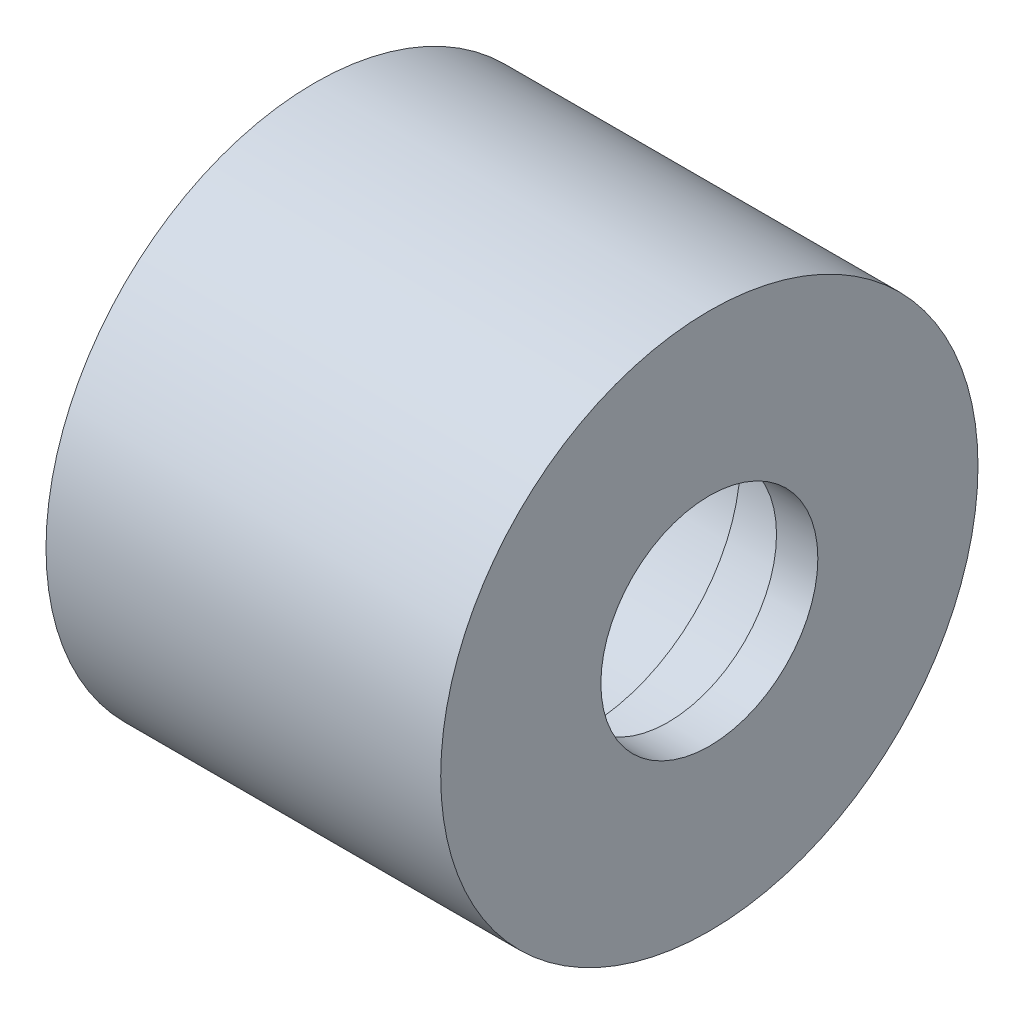
ISO-10303-21;
HEADER;
FILE_DESCRIPTION(('STEP AP214'),'2;1');
FILE_NAME('part.step','',(''),(''),'','','');
FILE_SCHEMA(('AUTOMOTIVE_DESIGN { 1 0 10303 214 1 1 1 1 }'));
ENDSEC;
DATA;
#1=APPLICATION_CONTEXT('core data for automotive mechanical design processes');
#2=APPLICATION_PROTOCOL_DEFINITION('international standard','automotive_design',2000,#1);
#3=PRODUCT_CONTEXT('',#1,'mechanical');
#4=PRODUCT('Part','Part','',(#3));
#5=PRODUCT_RELATED_PRODUCT_CATEGORY('part','',(#4));
#6=PRODUCT_DEFINITION_FORMATION('','',#4);
#7=PRODUCT_DEFINITION_CONTEXT('part definition',#1,'design');
#8=PRODUCT_DEFINITION('design','',#6,#7);
#9=PRODUCT_DEFINITION_SHAPE('','',#8);
#10=(LENGTH_UNIT() NAMED_UNIT(*) SI_UNIT(.MILLI.,.METRE.));
#11=(NAMED_UNIT(*) PLANE_ANGLE_UNIT() SI_UNIT($,.RADIAN.));
#12=(NAMED_UNIT(*) SI_UNIT($,.STERADIAN.) SOLID_ANGLE_UNIT());
#13=UNCERTAINTY_MEASURE_WITH_UNIT(LENGTH_MEASURE(1.E-05),#10,'distance_accuracy_value','');
#14=(GEOMETRIC_REPRESENTATION_CONTEXT(3) GLOBAL_UNCERTAINTY_ASSIGNED_CONTEXT((#13)) GLOBAL_UNIT_ASSIGNED_CONTEXT((#10,
#11,#12)) REPRESENTATION_CONTEXT('',''));
#15=CARTESIAN_POINT('',(0.,0.,0.));
#16=DIRECTION('',(0.,0.,1.));
#17=DIRECTION('',(1.,0.,0.));
#18=AXIS2_PLACEMENT_3D('',#15,#16,#17);
#19=CARTESIAN_POINT('',(-4.43776607242441,0.,0.));
#20=DIRECTION('',(-1.,0.,0.));
#21=DIRECTION('',(0.,0.,1.));
#22=AXIS2_PLACEMENT_3D('',#19,#20,#21);
#23=CYLINDRICAL_SURFACE('',#22,21.);
#24=CARTESIAN_POINT('',(0.,0.,0.));
#25=DIRECTION('',(-1.,0.,0.));
#26=DIRECTION('',(0.,0.,1.));
#27=AXIS2_PLACEMENT_3D('',#24,#25,#26);
#28=CIRCLE('',#27,21.);
#29=CARTESIAN_POINT('',(0.,0.,21.));
#30=VERTEX_POINT('',#29);
#31=EDGE_CURVE('E118',#30,#30,#28,.T.);
#32=ORIENTED_EDGE('',*,*,#31,.T.);
#33=EDGE_LOOP('',(#32));
#34=FACE_BOUND('',#33,.T.);
#35=CARTESIAN_POINT('',(15.5,0.,0.));
#36=DIRECTION('',(-1.,0.,0.));
#37=DIRECTION('',(0.,0.,1.));
#38=AXIS2_PLACEMENT_3D('',#35,#36,#37);
#39=CIRCLE('',#38,21.);
#40=CARTESIAN_POINT('',(15.5,0.,21.));
#41=VERTEX_POINT('',#40);
#42=EDGE_CURVE('E11',#41,#41,#39,.T.);
#43=ORIENTED_EDGE('',*,*,#42,.F.);
#44=EDGE_LOOP('',(#43));
#45=FACE_BOUND('',#44,.T.);
#46=ADVANCED_FACE('F47',(#34,#45),#23,.F.);
#47=CARTESIAN_POINT('',(15.5,0.,0.));
#48=DIRECTION('',(-1.,0.,0.));
#49=DIRECTION('',(0.,0.,1.));
#50=AXIS2_PLACEMENT_3D('',#47,#48,#49);
#51=PLANE('',#50);
#52=ORIENTED_EDGE('',*,*,#42,.T.);
#53=EDGE_LOOP('',(#52));
#54=FACE_BOUND('',#53,.T.);
#55=CARTESIAN_POINT('',(15.5,0.,0.));
#56=DIRECTION('',(-1.,0.,0.));
#57=DIRECTION('',(0.,0.,1.));
#58=AXIS2_PLACEMENT_3D('',#55,#56,#57);
#59=CIRCLE('',#58,20.);
#60=CARTESIAN_POINT('',(15.5,0.,20.));
#61=VERTEX_POINT('',#60);
#62=EDGE_CURVE('E54',#61,#61,#59,.T.);
#63=ORIENTED_EDGE('',*,*,#62,.F.);
#64=EDGE_LOOP('',(#63));
#65=FACE_BOUND('',#64,.T.);
#66=ADVANCED_FACE('F153',(#54,#65),#51,.T.);
#67=CARTESIAN_POINT('',(-4.43776607242441,0.,0.));
#68=DIRECTION('',(-1.,0.,0.));
#69=DIRECTION('',(0.,0.,1.));
#70=AXIS2_PLACEMENT_3D('',#67,#68,#69);
#71=CYLINDRICAL_SURFACE('',#70,20.);
#72=ORIENTED_EDGE('',*,*,#62,.T.);
#73=EDGE_LOOP('',(#72));
#74=FACE_BOUND('',#73,.T.);
#75=CARTESIAN_POINT('',(19.2,0.,0.));
#76=DIRECTION('',(-1.,0.,0.));
#77=DIRECTION('',(0.,0.,1.));
#78=AXIS2_PLACEMENT_3D('',#75,#76,#77);
#79=CIRCLE('',#78,20.);
#80=CARTESIAN_POINT('',(19.2,0.,20.));
#81=VERTEX_POINT('',#80);
#82=EDGE_CURVE('E145',#81,#81,#79,.T.);
#83=ORIENTED_EDGE('',*,*,#82,.F.);
#84=EDGE_LOOP('',(#83));
#85=FACE_BOUND('',#84,.T.);
#86=ADVANCED_FACE('F150',(#74,#85),#71,.F.);
#87=CARTESIAN_POINT('',(19.2,0.,0.));
#88=DIRECTION('',(-1.,0.,0.));
#89=DIRECTION('',(0.,0.,1.));
#90=AXIS2_PLACEMENT_3D('',#87,#88,#89);
#91=PLANE('',#90);
#92=ORIENTED_EDGE('',*,*,#82,.T.);
#93=EDGE_LOOP('',(#92));
#94=FACE_BOUND('',#93,.T.);
#95=CARTESIAN_POINT('',(19.2,0.,0.));
#96=DIRECTION('',(-1.,0.,0.));
#97=DIRECTION('',(0.,0.,1.));
#98=AXIS2_PLACEMENT_3D('',#95,#96,#97);
#99=CIRCLE('',#98,16.);
#100=CARTESIAN_POINT('',(19.2,0.,16.));
#101=VERTEX_POINT('',#100);
#102=EDGE_CURVE('E142',#101,#101,#99,.T.);
#103=ORIENTED_EDGE('',*,*,#102,.F.);
#104=EDGE_LOOP('',(#103));
#105=FACE_BOUND('',#104,.T.);
#106=ADVANCED_FACE('F160',(#94,#105),#91,.T.);
#107=CARTESIAN_POINT('',(-4.43776607242441,0.,0.));
#108=DIRECTION('',(-1.,0.,0.));
#109=DIRECTION('',(0.,0.,1.));
#110=AXIS2_PLACEMENT_3D('',#107,#108,#109);
#111=CYLINDRICAL_SURFACE('',#110,16.);
#112=ORIENTED_EDGE('',*,*,#102,.T.);
#113=EDGE_LOOP('',(#112));
#114=FACE_BOUND('',#113,.T.);
#115=CARTESIAN_POINT('',(26.2,0.,0.));
#116=DIRECTION('',(-1.,0.,0.));
#117=DIRECTION('',(0.,0.,1.));
#118=AXIS2_PLACEMENT_3D('',#115,#116,#117);
#119=CIRCLE('',#118,16.);
#120=CARTESIAN_POINT('',(26.2,0.,16.));
#121=VERTEX_POINT('',#120);
#122=EDGE_CURVE('E139',#121,#121,#119,.T.);
#123=ORIENTED_EDGE('',*,*,#122,.F.);
#124=EDGE_LOOP('',(#123));
#125=FACE_BOUND('',#124,.T.);
#126=ADVANCED_FACE('F166',(#114,#125),#111,.F.);
#127=CARTESIAN_POINT('',(26.2,0.,0.));
#128=DIRECTION('',(-1.,0.,0.));
#129=DIRECTION('',(0.,0.,1.));
#130=AXIS2_PLACEMENT_3D('',#127,#128,#129);
#131=PLANE('',#130);
#132=ORIENTED_EDGE('',*,*,#122,.T.);
#133=EDGE_LOOP('',(#132));
#134=FACE_BOUND('',#133,.T.);
#135=CARTESIAN_POINT('',(26.2,0.,0.));
#136=DIRECTION('',(-1.,0.,0.));
#137=DIRECTION('',(0.,0.,1.));
#138=AXIS2_PLACEMENT_3D('',#135,#136,#137);
#139=CIRCLE('',#138,15.);
#140=CARTESIAN_POINT('',(26.2,0.,15.));
#141=VERTEX_POINT('',#140);
#142=EDGE_CURVE('E136',#141,#141,#139,.T.);
#143=ORIENTED_EDGE('',*,*,#142,.F.);
#144=EDGE_LOOP('',(#143));
#145=FACE_BOUND('',#144,.T.);
#146=ADVANCED_FACE('F170',(#134,#145),#131,.T.);
#147=CARTESIAN_POINT('',(-4.43776607242441,0.,0.));
#148=DIRECTION('',(-1.,0.,0.));
#149=DIRECTION('',(0.,0.,1.));
#150=AXIS2_PLACEMENT_3D('',#147,#148,#149);
#151=CYLINDRICAL_SURFACE('',#150,15.);
#152=ORIENTED_EDGE('',*,*,#142,.T.);
#153=EDGE_LOOP('',(#152));
#154=FACE_BOUND('',#153,.T.);
#155=CARTESIAN_POINT('',(34.2,0.,0.));
#156=DIRECTION('',(-1.,0.,0.));
#157=DIRECTION('',(0.,0.,1.));
#158=AXIS2_PLACEMENT_3D('',#155,#156,#157);
#159=CIRCLE('',#158,15.);
#160=CARTESIAN_POINT('',(34.2,0.,15.));
#161=VERTEX_POINT('',#160);
#162=EDGE_CURVE('E133',#161,#161,#159,.T.);
#163=ORIENTED_EDGE('',*,*,#162,.F.);
#164=EDGE_LOOP('',(#163));
#165=FACE_BOUND('',#164,.T.);
#166=ADVANCED_FACE('F174',(#154,#165),#151,.F.);
#167=CARTESIAN_POINT('',(34.2,0.,0.));
#168=DIRECTION('',(-1.,0.,0.));
#169=DIRECTION('',(0.,0.,1.));
#170=AXIS2_PLACEMENT_3D('',#167,#168,#169);
#171=PLANE('',#170);
#172=ORIENTED_EDGE('',*,*,#162,.T.);
#173=EDGE_LOOP('',(#172));
#174=FACE_BOUND('',#173,.T.);
#175=CARTESIAN_POINT('',(34.2,0.,0.));
#176=DIRECTION('',(-1.,0.,0.));
#177=DIRECTION('',(0.,0.,1.));
#178=AXIS2_PLACEMENT_3D('',#175,#176,#177);
#179=CIRCLE('',#178,10.5);
#180=CARTESIAN_POINT('',(34.2,0.,10.5));
#181=VERTEX_POINT('',#180);
#182=EDGE_CURVE('E130',#181,#181,#179,.T.);
#183=ORIENTED_EDGE('',*,*,#182,.F.);
#184=EDGE_LOOP('',(#183));
#185=FACE_BOUND('',#184,.T.);
#186=ADVANCED_FACE('F178',(#174,#185),#171,.T.);
#187=CARTESIAN_POINT('',(-4.43776607242441,0.,0.));
#188=DIRECTION('',(-1.,0.,0.));
#189=DIRECTION('',(0.,0.,1.));
#190=AXIS2_PLACEMENT_3D('',#187,#188,#189);
#191=CYLINDRICAL_SURFACE('',#190,10.5);
#192=ORIENTED_EDGE('',*,*,#182,.T.);
#193=EDGE_LOOP('',(#192));
#194=FACE_BOUND('',#193,.T.);
#195=CARTESIAN_POINT('',(38.2,0.,0.));
#196=DIRECTION('',(-1.,0.,0.));
#197=DIRECTION('',(0.,0.,1.));
#198=AXIS2_PLACEMENT_3D('',#195,#196,#197);
#199=CIRCLE('',#198,10.5);
#200=CARTESIAN_POINT('',(38.2,0.,10.5));
#201=VERTEX_POINT('',#200);
#202=EDGE_CURVE('E127',#201,#201,#199,.T.);
#203=ORIENTED_EDGE('',*,*,#202,.F.);
#204=EDGE_LOOP('',(#203));
#205=FACE_BOUND('',#204,.T.);
#206=ADVANCED_FACE('F182',(#194,#205),#191,.F.);
#207=CARTESIAN_POINT('',(38.2,0.,0.));
#208=DIRECTION('',(1.,0.,0.));
#209=DIRECTION('',(0.,0.,-1.));
#210=AXIS2_PLACEMENT_3D('',#207,#208,#209);
#211=PLANE('',#210);
#212=ORIENTED_EDGE('',*,*,#202,.T.);
#213=EDGE_LOOP('',(#212));
#214=FACE_BOUND('',#213,.T.);
#215=CARTESIAN_POINT('',(38.2,0.,0.));
#216=DIRECTION('',(-1.,0.,0.));
#217=DIRECTION('',(0.,0.,1.));
#218=AXIS2_PLACEMENT_3D('',#215,#216,#217);
#219=CIRCLE('',#218,26.);
#220=CARTESIAN_POINT('',(38.2,0.,26.));
#221=VERTEX_POINT('',#220);
#222=EDGE_CURVE('E124',#221,#221,#219,.T.);
#223=ORIENTED_EDGE('',*,*,#222,.F.);
#224=EDGE_LOOP('',(#223));
#225=FACE_BOUND('',#224,.T.);
#226=ADVANCED_FACE('F186',(#214,#225),#211,.T.);
#227=CARTESIAN_POINT('',(-4.43776607242441,0.,0.));
#228=DIRECTION('',(-1.,0.,0.));
#229=DIRECTION('',(0.,0.,1.));
#230=AXIS2_PLACEMENT_3D('',#227,#228,#229);
#231=CYLINDRICAL_SURFACE('',#230,26.);
#232=ORIENTED_EDGE('',*,*,#222,.T.);
#233=EDGE_LOOP('',(#232));
#234=FACE_BOUND('',#233,.T.);
#235=CARTESIAN_POINT('',(0.,0.,0.));
#236=DIRECTION('',(-1.,0.,0.));
#237=DIRECTION('',(0.,0.,1.));
#238=AXIS2_PLACEMENT_3D('',#235,#236,#237);
#239=CIRCLE('',#238,26.);
#240=CARTESIAN_POINT('',(0.,0.,26.));
#241=VERTEX_POINT('',#240);
#242=EDGE_CURVE('E121',#241,#241,#239,.T.);
#243=ORIENTED_EDGE('',*,*,#242,.F.);
#244=EDGE_LOOP('',(#243));
#245=FACE_BOUND('',#244,.T.);
#246=ADVANCED_FACE('F190',(#234,#245),#231,.T.);
#247=CARTESIAN_POINT('',(0.,0.,0.));
#248=DIRECTION('',(-1.,0.,0.));
#249=DIRECTION('',(0.,0.,1.));
#250=AXIS2_PLACEMENT_3D('',#247,#248,#249);
#251=PLANE('',#250);
#252=CARTESIAN_POINT('',(0.,2.20309881449055E-13,23.5));
#253=DIRECTION('',(-1.,0.,0.));
#254=DIRECTION('',(0.,0.,1.));
#255=AXIS2_PLACEMENT_3D('',#252,#253,#254);
#256=CIRCLE('',#255,1.24999999999999);
#257=CARTESIAN_POINT('',(0.,2.20309881449055E-13,24.75));
#258=VERTEX_POINT('',#257);
#259=EDGE_CURVE('E84',#258,#258,#256,.T.);
#260=ORIENTED_EDGE('',*,*,#259,.F.);
#261=EDGE_LOOP('',(#260));
#262=FACE_BOUND('',#261,.T.);
#263=CARTESIAN_POINT('',(0.,-20.3515969889342,11.7500000000001));
#264=DIRECTION('',(-1.,0.,0.));
#265=DIRECTION('',(0.,0.,1.));
#266=AXIS2_PLACEMENT_3D('',#263,#264,#265);
#267=CIRCLE('',#266,1.24999999999999);
#268=CARTESIAN_POINT('',(0.,-20.3515969889342,13.0000000000001));
#269=VERTEX_POINT('',#268);
#270=EDGE_CURVE('E83',#269,#269,#267,.T.);
#271=ORIENTED_EDGE('',*,*,#270,.F.);
#272=EDGE_LOOP('',(#271));
#273=FACE_BOUND('',#272,.T.);
#274=CARTESIAN_POINT('',(0.,-20.3515969889343,-11.75));
#275=DIRECTION('',(-1.,0.,0.));
#276=DIRECTION('',(0.,0.,1.));
#277=AXIS2_PLACEMENT_3D('',#274,#275,#276);
#278=CIRCLE('',#277,1.24999999999999);
#279=CARTESIAN_POINT('',(0.,-20.3515969889343,-10.5000000000001));
#280=VERTEX_POINT('',#279);
#281=EDGE_CURVE('E94',#280,#280,#278,.T.);
#282=ORIENTED_EDGE('',*,*,#281,.F.);
#283=EDGE_LOOP('',(#282));
#284=FACE_BOUND('',#283,.T.);
#285=CARTESIAN_POINT('',(0.,0.,-23.5));
#286=DIRECTION('',(-1.,0.,0.));
#287=DIRECTION('',(0.,0.,1.));
#288=AXIS2_PLACEMENT_3D('',#285,#286,#287);
#289=CIRCLE('',#288,1.24999999999999);
#290=CARTESIAN_POINT('',(0.,0.,-22.25));
#291=VERTEX_POINT('',#290);
#292=EDGE_CURVE('E100',#291,#291,#289,.T.);
#293=ORIENTED_EDGE('',*,*,#292,.F.);
#294=EDGE_LOOP('',(#293));
#295=FACE_BOUND('',#294,.T.);
#296=CARTESIAN_POINT('',(0.,20.3515969889343,-11.75));
#297=DIRECTION('',(-1.,0.,0.));
#298=DIRECTION('',(0.,0.,1.));
#299=AXIS2_PLACEMENT_3D('',#296,#297,#298);
#300=CIRCLE('',#299,1.24999999999999);
#301=CARTESIAN_POINT('',(0.,20.3515969889343,-10.5));
#302=VERTEX_POINT('',#301);
#303=EDGE_CURVE('E106',#302,#302,#300,.T.);
#304=ORIENTED_EDGE('',*,*,#303,.F.);
#305=EDGE_LOOP('',(#304));
#306=FACE_BOUND('',#305,.T.);
#307=CARTESIAN_POINT('',(0.,20.3515969889343,11.75));
#308=DIRECTION('',(-1.,0.,0.));
#309=DIRECTION('',(0.,0.,1.));
#310=AXIS2_PLACEMENT_3D('',#307,#308,#309);
#311=CIRCLE('',#310,1.24999999999999);
#312=CARTESIAN_POINT('',(0.,20.3515969889343,13.));
#313=VERTEX_POINT('',#312);
#314=EDGE_CURVE('E112',#313,#313,#311,.T.);
#315=ORIENTED_EDGE('',*,*,#314,.F.);
#316=EDGE_LOOP('',(#315));
#317=FACE_BOUND('',#316,.T.);
#318=ORIENTED_EDGE('',*,*,#242,.T.);
#319=EDGE_LOOP('',(#318));
#320=FACE_BOUND('',#319,.T.);
#321=ORIENTED_EDGE('',*,*,#31,.F.);
#322=EDGE_LOOP('',(#321));
#323=FACE_BOUND('',#322,.T.);
#324=ADVANCED_FACE('F194',(#262,#273,#284,#295,#306,#317,#320,#323),#251,.T.);
#325=CARTESIAN_POINT('',(7.49999999999999,20.3515969889343,11.75));
#326=DIRECTION('',(-1.,0.,0.));
#327=DIRECTION('',(0.,0.,1.));
#328=AXIS2_PLACEMENT_3D('',#325,#326,#327);
#329=CONICAL_SURFACE('',#328,1.24999999999999,1.02974425867664);
#330=CARTESIAN_POINT('',(8.25107577378445,20.3515969889343,11.75));
#331=VERTEX_POINT('',#330);
#332=VERTEX_LOOP('',#331);
#333=FACE_BOUND('',#332,.T.);
#334=CARTESIAN_POINT('',(7.49999999999999,20.3515969889343,11.75));
#335=DIRECTION('',(-1.,0.,0.));
#336=DIRECTION('',(0.,0.,1.));
#337=AXIS2_PLACEMENT_3D('',#334,#335,#336);
#338=CIRCLE('',#337,1.24999999999999);
#339=CARTESIAN_POINT('',(7.49999999999999,20.3515969889343,13.));
#340=VERTEX_POINT('',#339);
#341=EDGE_CURVE('E115',#340,#340,#338,.T.);
#342=ORIENTED_EDGE('',*,*,#341,.T.);
#343=EDGE_LOOP('',(#342));
#344=FACE_BOUND('',#343,.T.);
#345=ADVANCED_FACE('F198',(#333,#344),#329,.F.);
#346=CARTESIAN_POINT('',(0.,20.3515969889343,11.75));
#347=DIRECTION('',(-1.,0.,0.));
#348=DIRECTION('',(0.,0.,1.));
#349=AXIS2_PLACEMENT_3D('',#346,#347,#348);
#350=CYLINDRICAL_SURFACE('',#349,1.24999999999999);
#351=ORIENTED_EDGE('',*,*,#341,.F.);
#352=EDGE_LOOP('',(#351));
#353=FACE_BOUND('',#352,.T.);
#354=ORIENTED_EDGE('',*,*,#314,.T.);
#355=EDGE_LOOP('',(#354));
#356=FACE_BOUND('',#355,.T.);
#357=ADVANCED_FACE('F202',(#353,#356),#350,.F.);
#358=CARTESIAN_POINT('',(7.49999999999999,20.3515969889343,-11.75));
#359=DIRECTION('',(-1.,0.,0.));
#360=DIRECTION('',(0.,0.,1.));
#361=AXIS2_PLACEMENT_3D('',#358,#359,#360);
#362=CONICAL_SURFACE('',#361,1.24999999999999,1.02974425867664);
#363=CARTESIAN_POINT('',(8.25107577378445,20.3515969889343,-11.75));
#364=VERTEX_POINT('',#363);
#365=VERTEX_LOOP('',#364);
#366=FACE_BOUND('',#365,.T.);
#367=CARTESIAN_POINT('',(7.49999999999999,20.3515969889343,-11.75));
#368=DIRECTION('',(-1.,0.,0.));
#369=DIRECTION('',(0.,0.,1.));
#370=AXIS2_PLACEMENT_3D('',#367,#368,#369);
#371=CIRCLE('',#370,1.24999999999999);
#372=CARTESIAN_POINT('',(7.49999999999999,20.3515969889343,-10.5));
#373=VERTEX_POINT('',#372);
#374=EDGE_CURVE('E109',#373,#373,#371,.T.);
#375=ORIENTED_EDGE('',*,*,#374,.T.);
#376=EDGE_LOOP('',(#375));
#377=FACE_BOUND('',#376,.T.);
#378=ADVANCED_FACE('F205',(#366,#377),#362,.F.);
#379=CARTESIAN_POINT('',(0.,20.3515969889343,-11.75));
#380=DIRECTION('',(-1.,0.,0.));
#381=DIRECTION('',(0.,0.,1.));
#382=AXIS2_PLACEMENT_3D('',#379,#380,#381);
#383=CYLINDRICAL_SURFACE('',#382,1.24999999999999);
#384=ORIENTED_EDGE('',*,*,#374,.F.);
#385=EDGE_LOOP('',(#384));
#386=FACE_BOUND('',#385,.T.);
#387=ORIENTED_EDGE('',*,*,#303,.T.);
#388=EDGE_LOOP('',(#387));
#389=FACE_BOUND('',#388,.T.);
#390=ADVANCED_FACE('F209',(#386,#389),#383,.F.);
#391=CARTESIAN_POINT('',(7.49999999999999,0.,-23.5));
#392=DIRECTION('',(-1.,0.,0.));
#393=DIRECTION('',(0.,0.,1.));
#394=AXIS2_PLACEMENT_3D('',#391,#392,#393);
#395=CONICAL_SURFACE('',#394,1.24999999999999,1.02974425867664);
#396=CARTESIAN_POINT('',(8.25107577378445,0.,-23.5));
#397=VERTEX_POINT('',#396);
#398=VERTEX_LOOP('',#397);
#399=FACE_BOUND('',#398,.T.);
#400=CARTESIAN_POINT('',(7.49999999999999,0.,-23.5));
#401=DIRECTION('',(-1.,0.,0.));
#402=DIRECTION('',(0.,0.,1.));
#403=AXIS2_PLACEMENT_3D('',#400,#401,#402);
#404=CIRCLE('',#403,1.24999999999999);
#405=CARTESIAN_POINT('',(7.49999999999999,0.,-22.25));
#406=VERTEX_POINT('',#405);
#407=EDGE_CURVE('E103',#406,#406,#404,.T.);
#408=ORIENTED_EDGE('',*,*,#407,.T.);
#409=EDGE_LOOP('',(#408));
#410=FACE_BOUND('',#409,.T.);
#411=ADVANCED_FACE('F212',(#399,#410),#395,.F.);
#412=CARTESIAN_POINT('',(0.,0.,-23.5));
#413=DIRECTION('',(-1.,0.,0.));
#414=DIRECTION('',(0.,0.,1.));
#415=AXIS2_PLACEMENT_3D('',#412,#413,#414);
#416=CYLINDRICAL_SURFACE('',#415,1.24999999999999);
#417=ORIENTED_EDGE('',*,*,#407,.F.);
#418=EDGE_LOOP('',(#417));
#419=FACE_BOUND('',#418,.T.);
#420=ORIENTED_EDGE('',*,*,#292,.T.);
#421=EDGE_LOOP('',(#420));
#422=FACE_BOUND('',#421,.T.);
#423=ADVANCED_FACE('F216',(#419,#422),#416,.F.);
#424=CARTESIAN_POINT('',(7.49999999999999,-20.3515969889343,-11.75));
#425=DIRECTION('',(-1.,0.,0.));
#426=DIRECTION('',(0.,0.,1.));
#427=AXIS2_PLACEMENT_3D('',#424,#425,#426);
#428=CONICAL_SURFACE('',#427,1.24999999999999,1.02974425867664);
#429=CARTESIAN_POINT('',(8.25107577378445,-20.3515969889343,-11.75));
#430=VERTEX_POINT('',#429);
#431=VERTEX_LOOP('',#430);
#432=FACE_BOUND('',#431,.T.);
#433=CARTESIAN_POINT('',(7.49999999999999,-20.3515969889343,-11.75));
#434=DIRECTION('',(-1.,0.,0.));
#435=DIRECTION('',(0.,0.,1.));
#436=AXIS2_PLACEMENT_3D('',#433,#434,#435);
#437=CIRCLE('',#436,1.24999999999999);
#438=CARTESIAN_POINT('',(7.49999999999999,-20.3515969889343,-10.5000000000001));
#439=VERTEX_POINT('',#438);
#440=EDGE_CURVE('E97',#439,#439,#437,.T.);
#441=ORIENTED_EDGE('',*,*,#440,.T.);
#442=EDGE_LOOP('',(#441));
#443=FACE_BOUND('',#442,.T.);
#444=ADVANCED_FACE('F220',(#432,#443),#428,.F.);
#445=CARTESIAN_POINT('',(0.,-20.3515969889343,-11.75));
#446=DIRECTION('',(-1.,0.,0.));
#447=DIRECTION('',(0.,0.,1.));
#448=AXIS2_PLACEMENT_3D('',#445,#446,#447);
#449=CYLINDRICAL_SURFACE('',#448,1.24999999999999);
#450=ORIENTED_EDGE('',*,*,#440,.F.);
#451=EDGE_LOOP('',(#450));
#452=FACE_BOUND('',#451,.T.);
#453=ORIENTED_EDGE('',*,*,#281,.T.);
#454=EDGE_LOOP('',(#453));
#455=FACE_BOUND('',#454,.T.);
#456=ADVANCED_FACE('F224',(#452,#455),#449,.F.);
#457=CARTESIAN_POINT('',(7.49999999999999,-20.3515969889342,11.7500000000001));
#458=DIRECTION('',(-1.,0.,0.));
#459=DIRECTION('',(0.,0.,1.));
#460=AXIS2_PLACEMENT_3D('',#457,#458,#459);
#461=CONICAL_SURFACE('',#460,1.24999999999999,1.02974425867664);
#462=CARTESIAN_POINT('',(8.25107577378445,-20.3515969889342,11.7500000000001));
#463=VERTEX_POINT('',#462);
#464=VERTEX_LOOP('',#463);
#465=FACE_BOUND('',#464,.T.);
#466=CARTESIAN_POINT('',(7.49999999999999,-20.3515969889342,11.7500000000001));
#467=DIRECTION('',(-1.,0.,0.));
#468=DIRECTION('',(0.,0.,1.));
#469=AXIS2_PLACEMENT_3D('',#466,#467,#468);
#470=CIRCLE('',#469,1.24999999999999);
#471=CARTESIAN_POINT('',(7.49999999999999,-20.3515969889342,13.0000000000001));
#472=VERTEX_POINT('',#471);
#473=EDGE_CURVE('E87',#472,#472,#470,.T.);
#474=ORIENTED_EDGE('',*,*,#473,.T.);
#475=EDGE_LOOP('',(#474));
#476=FACE_BOUND('',#475,.T.);
#477=ADVANCED_FACE('F228',(#465,#476),#461,.F.);
#478=CARTESIAN_POINT('',(0.,-20.3515969889342,11.7500000000001));
#479=DIRECTION('',(-1.,0.,0.));
#480=DIRECTION('',(0.,0.,1.));
#481=AXIS2_PLACEMENT_3D('',#478,#479,#480);
#482=CYLINDRICAL_SURFACE('',#481,1.24999999999999);
#483=ORIENTED_EDGE('',*,*,#473,.F.);
#484=EDGE_LOOP('',(#483));
#485=FACE_BOUND('',#484,.T.);
#486=ORIENTED_EDGE('',*,*,#270,.T.);
#487=EDGE_LOOP('',(#486));
#488=FACE_BOUND('',#487,.T.);
#489=ADVANCED_FACE('F77',(#485,#488),#482,.F.);
#490=CARTESIAN_POINT('',(7.49999999999999,2.20309881449055E-13,23.5));
#491=DIRECTION('',(-1.,0.,0.));
#492=DIRECTION('',(0.,0.,1.));
#493=AXIS2_PLACEMENT_3D('',#490,#491,#492);
#494=CONICAL_SURFACE('',#493,1.24999999999999,1.02974425867664);
#495=CARTESIAN_POINT('',(8.25107577378445,2.18288950741877E-13,23.5));
#496=VERTEX_POINT('',#495);
#497=VERTEX_LOOP('',#496);
#498=FACE_BOUND('',#497,.T.);
#499=CARTESIAN_POINT('',(7.49999999999999,2.20309881449055E-13,23.5));
#500=DIRECTION('',(-1.,0.,0.));
#501=DIRECTION('',(0.,0.,1.));
#502=AXIS2_PLACEMENT_3D('',#499,#500,#501);
#503=CIRCLE('',#502,1.24999999999999);
#504=CARTESIAN_POINT('',(7.49999999999999,2.20309881449055E-13,24.75));
#505=VERTEX_POINT('',#504);
#506=EDGE_CURVE('E81',#505,#505,#503,.T.);
#507=ORIENTED_EDGE('',*,*,#506,.T.);
#508=EDGE_LOOP('',(#507));
#509=FACE_BOUND('',#508,.T.);
#510=ADVANCED_FACE('F73',(#498,#509),#494,.F.);
#511=CARTESIAN_POINT('',(0.,2.20309881449055E-13,23.5));
#512=DIRECTION('',(-1.,0.,0.));
#513=DIRECTION('',(0.,0.,1.));
#514=AXIS2_PLACEMENT_3D('',#511,#512,#513);
#515=CYLINDRICAL_SURFACE('',#514,1.24999999999999);
#516=ORIENTED_EDGE('',*,*,#506,.F.);
#517=EDGE_LOOP('',(#516));
#518=FACE_BOUND('',#517,.T.);
#519=ORIENTED_EDGE('',*,*,#259,.T.);
#520=EDGE_LOOP('',(#519));
#521=FACE_BOUND('',#520,.T.);
#522=ADVANCED_FACE('F76',(#518,#521),#515,.F.);
#523=CLOSED_SHELL('',(#46,#66,#86,#106,#126,#146,#166,#186,#206,#226,#246,#324,#345,#357,#378,
#390,#411,#423,#444,#456,#477,#489,#510,#522));
#524=MANIFOLD_SOLID_BREP('B2',#523);
#525=ADVANCED_BREP_SHAPE_REPRESENTATION('',(#18,#524),#14);
#526=SHAPE_DEFINITION_REPRESENTATION(#9,#525);
ENDSEC;
END-ISO-10303-21;
